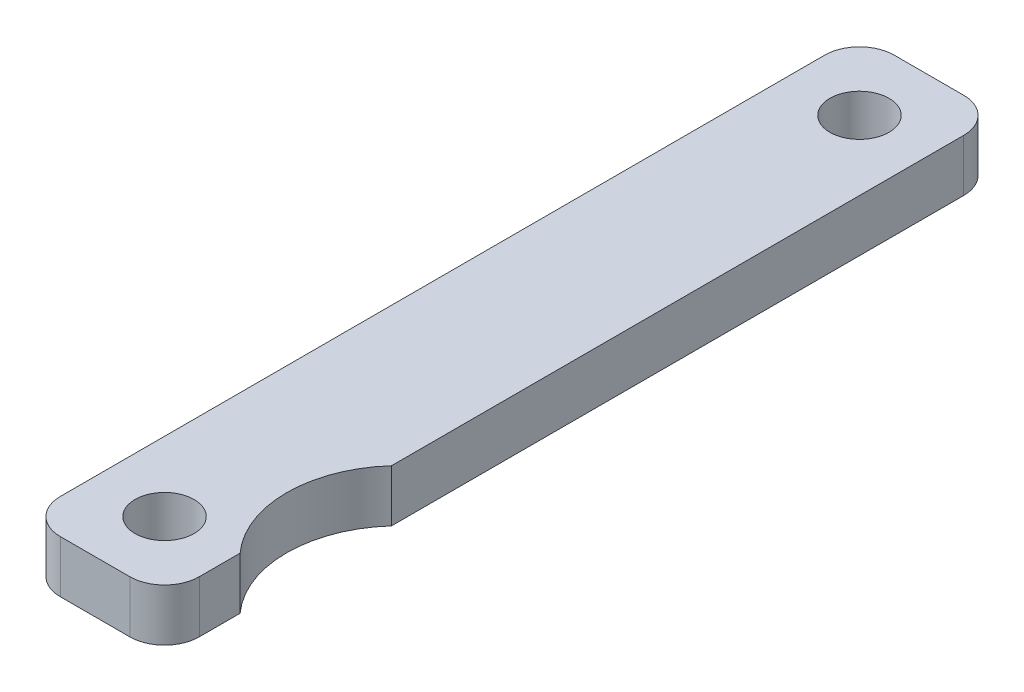
ISO-10303-21;
HEADER;
FILE_DESCRIPTION(('STEP AP214'),'2;1');
FILE_NAME('part.step','',(''),(''),'','','');
FILE_SCHEMA(('AUTOMOTIVE_DESIGN { 1 0 10303 214 1 1 1 1 }'));
ENDSEC;
DATA;
#1=APPLICATION_CONTEXT('core data for automotive mechanical design processes');
#2=APPLICATION_PROTOCOL_DEFINITION('international standard','automotive_design',2000,#1);
#3=PRODUCT_CONTEXT('',#1,'mechanical');
#4=PRODUCT('Part','Part','',(#3));
#5=PRODUCT_RELATED_PRODUCT_CATEGORY('part','',(#4));
#6=PRODUCT_DEFINITION_FORMATION('','',#4);
#7=PRODUCT_DEFINITION_CONTEXT('part definition',#1,'design');
#8=PRODUCT_DEFINITION('design','',#6,#7);
#9=PRODUCT_DEFINITION_SHAPE('','',#8);
#10=(LENGTH_UNIT() NAMED_UNIT(*) SI_UNIT(.MILLI.,.METRE.));
#11=(NAMED_UNIT(*) PLANE_ANGLE_UNIT() SI_UNIT($,.RADIAN.));
#12=(NAMED_UNIT(*) SI_UNIT($,.STERADIAN.) SOLID_ANGLE_UNIT());
#13=UNCERTAINTY_MEASURE_WITH_UNIT(LENGTH_MEASURE(1.E-05),#10,'distance_accuracy_value','');
#14=(GEOMETRIC_REPRESENTATION_CONTEXT(3) GLOBAL_UNCERTAINTY_ASSIGNED_CONTEXT((#13)) GLOBAL_UNIT_ASSIGNED_CONTEXT((#10,
#11,#12)) REPRESENTATION_CONTEXT('',''));
#15=CARTESIAN_POINT('',(0.,0.,0.));
#16=DIRECTION('',(0.,0.,1.));
#17=DIRECTION('',(1.,0.,0.));
#18=AXIS2_PLACEMENT_3D('',#15,#16,#17);
#19=CARTESIAN_POINT('',(4.00000000000001,3.,-22.));
#20=DIRECTION('',(-1.,0.,0.));
#21=DIRECTION('',(0.,0.,1.));
#22=AXIS2_PLACEMENT_3D('',#19,#20,#21);
#23=PLANE('',#22);
#24=DIRECTION('',(0.,0.,-1.));
#25=VECTOR('',#24,1.);
#26=CARTESIAN_POINT('',(4.00000000000001,0.,-22.));
#27=LINE('',#26,#25);
#28=CARTESIAN_POINT('',(4.00000000000001,0.,22.));
#29=VERTEX_POINT('',#28);
#30=CARTESIAN_POINT('',(4.00000000000001,0.,19.651084740786));
#31=VERTEX_POINT('',#30);
#32=EDGE_CURVE('E326',#29,#31,#27,.T.);
#33=ORIENTED_EDGE('',*,*,#32,.T.);
#34=DIRECTION('',(0.,1.,0.));
#35=VECTOR('',#34,1.);
#36=CARTESIAN_POINT('',(4.00000000000001,-12.5405838275533,19.651084740786));
#37=LINE('',#36,#35);
#38=CARTESIAN_POINT('',(4.00000000000001,3.,19.651084740786));
#39=VERTEX_POINT('',#38);
#40=EDGE_CURVE('E44',#31,#39,#37,.T.);
#41=ORIENTED_EDGE('',*,*,#40,.T.);
#42=DIRECTION('',(0.,0.,-1.));
#43=VECTOR('',#42,1.);
#44=CARTESIAN_POINT('',(4.00000000000001,3.,-22.));
#45=LINE('',#44,#43);
#46=CARTESIAN_POINT('',(4.00000000000001,3.,22.));
#47=VERTEX_POINT('',#46);
#48=EDGE_CURVE('E275',#47,#39,#45,.T.);
#49=ORIENTED_EDGE('',*,*,#48,.F.);
#50=DIRECTION('',(0.,-1.,0.));
#51=VECTOR('',#50,1.);
#52=CARTESIAN_POINT('',(4.00000000000001,3.,22.));
#53=LINE('',#52,#51);
#54=EDGE_CURVE('E218',#47,#29,#53,.T.);
#55=ORIENTED_EDGE('',*,*,#54,.T.);
#56=EDGE_LOOP('',(#33,#41,#49,#55));
#57=FACE_BOUND('',#56,.T.);
#58=ADVANCED_FACE('F210',(#57),#23,.F.);
#59=CARTESIAN_POINT('',(2.00000000000001,3.,22.));
#60=DIRECTION('',(0.,1.,0.));
#61=DIRECTION('',(0.,0.,1.));
#62=AXIS2_PLACEMENT_3D('',#59,#60,#61);
#63=PLANE('',#62);
#64=CARTESIAN_POINT('',(8.8234693724446,3.,15.2940050750569));
#65=DIRECTION('',(0.,1.,0.));
#66=DIRECTION('',(0.,0.,1.));
#67=AXIS2_PLACEMENT_3D('',#64,#65,#66);
#68=CIRCLE('',#67,6.50000000003239);
#69=CARTESIAN_POINT('',(4.00000000000001,3.,10.9369254093278));
#70=VERTEX_POINT('',#69);
#71=EDGE_CURVE('E368',#70,#39,#68,.T.);
#72=ORIENTED_EDGE('',*,*,#71,.F.);
#73=CARTESIAN_POINT('',(4.00000000000001,3.,-22.));
#74=VERTEX_POINT('',#73);
#75=EDGE_CURVE('E381',#70,#74,#45,.T.);
#76=ORIENTED_EDGE('',*,*,#75,.T.);
#77=CARTESIAN_POINT('',(2.00000000000001,3.,-22.));
#78=DIRECTION('',(0.,1.,0.));
#79=DIRECTION('',(0.,0.,-1.));
#80=AXIS2_PLACEMENT_3D('',#77,#78,#79);
#81=CIRCLE('',#80,2.);
#82=CARTESIAN_POINT('',(2.00000000000001,3.,-24.));
#83=VERTEX_POINT('',#82);
#84=EDGE_CURVE('E383',#74,#83,#81,.T.);
#85=ORIENTED_EDGE('',*,*,#84,.T.);
#86=DIRECTION('',(-1.,0.,0.));
#87=VECTOR('',#86,1.);
#88=CARTESIAN_POINT('',(-2.00000000000001,3.,-24.));
#89=LINE('',#88,#87);
#90=CARTESIAN_POINT('',(-2.00000000000001,3.,-24.));
#91=VERTEX_POINT('',#90);
#92=EDGE_CURVE('E385',#83,#91,#89,.T.);
#93=ORIENTED_EDGE('',*,*,#92,.T.);
#94=CARTESIAN_POINT('',(-2.00000000000001,3.,-22.));
#95=DIRECTION('',(0.,1.,0.));
#96=DIRECTION('',(0.,0.,1.));
#97=AXIS2_PLACEMENT_3D('',#94,#95,#96);
#98=CIRCLE('',#97,2.);
#99=CARTESIAN_POINT('',(-4.00000000000001,3.,-22.));
#100=VERTEX_POINT('',#99);
#101=EDGE_CURVE('E300',#91,#100,#98,.T.);
#102=ORIENTED_EDGE('',*,*,#101,.T.);
#103=DIRECTION('',(0.,0.,1.));
#104=VECTOR('',#103,1.);
#105=CARTESIAN_POINT('',(-4.00000000000001,3.,-22.));
#106=LINE('',#105,#104);
#107=CARTESIAN_POINT('',(-4.,3.,22.));
#108=VERTEX_POINT('',#107);
#109=EDGE_CURVE('E291',#100,#108,#106,.T.);
#110=ORIENTED_EDGE('',*,*,#109,.T.);
#111=CARTESIAN_POINT('',(-2.,3.,22.));
#112=DIRECTION('',(0.,1.,0.));
#113=DIRECTION('',(0.,0.,1.));
#114=AXIS2_PLACEMENT_3D('',#111,#112,#113);
#115=CIRCLE('',#114,2.);
#116=CARTESIAN_POINT('',(-2.00000000000001,3.,24.));
#117=VERTEX_POINT('',#116);
#118=EDGE_CURVE('E297',#108,#117,#115,.T.);
#119=ORIENTED_EDGE('',*,*,#118,.T.);
#120=DIRECTION('',(1.,0.,0.));
#121=VECTOR('',#120,1.);
#122=CARTESIAN_POINT('',(-2.00000000000001,3.,24.));
#123=LINE('',#122,#121);
#124=CARTESIAN_POINT('',(2.00000000000001,3.,24.));
#125=VERTEX_POINT('',#124);
#126=EDGE_CURVE('E234',#117,#125,#123,.T.);
#127=ORIENTED_EDGE('',*,*,#126,.T.);
#128=CARTESIAN_POINT('',(2.00000000000001,3.,22.));
#129=DIRECTION('',(0.,1.,0.));
#130=DIRECTION('',(0.,0.,1.));
#131=AXIS2_PLACEMENT_3D('',#128,#129,#130);
#132=CIRCLE('',#131,2.);
#133=EDGE_CURVE('E339',#125,#47,#132,.T.);
#134=ORIENTED_EDGE('',*,*,#133,.T.);
#135=ORIENTED_EDGE('',*,*,#48,.T.);
#136=EDGE_LOOP('',(#72,#76,#85,#93,#102,#110,#119,#127,#134,#135));
#137=FACE_BOUND('',#136,.T.);
#138=CARTESIAN_POINT('',(0.,3.,-20.));
#139=DIRECTION('',(0.,1.,0.));
#140=DIRECTION('',(0.,0.,1.));
#141=AXIS2_PLACEMENT_3D('',#138,#139,#140);
#142=CIRCLE('',#141,1.7);
#143=CARTESIAN_POINT('',(0.,3.,-18.3));
#144=VERTEX_POINT('',#143);
#145=EDGE_CURVE('E325',#144,#144,#142,.T.);
#146=ORIENTED_EDGE('',*,*,#145,.F.);
#147=EDGE_LOOP('',(#146));
#148=FACE_BOUND('',#147,.T.);
#149=CARTESIAN_POINT('',(0.,3.,20.));
#150=DIRECTION('',(0.,1.,0.));
#151=DIRECTION('',(0.,0.,-1.));
#152=AXIS2_PLACEMENT_3D('',#149,#150,#151);
#153=CIRCLE('',#152,1.7);
#154=CARTESIAN_POINT('',(0.,3.,18.3));
#155=VERTEX_POINT('',#154);
#156=EDGE_CURVE('E366',#155,#155,#153,.T.);
#157=ORIENTED_EDGE('',*,*,#156,.F.);
#158=EDGE_LOOP('',(#157));
#159=FACE_BOUND('',#158,.T.);
#160=ADVANCED_FACE('F294',(#137,#148,#159),#63,.T.);
#161=CARTESIAN_POINT('',(2.00000000000001,0.,22.));
#162=DIRECTION('',(0.,1.,0.));
#163=DIRECTION('',(0.,0.,1.));
#164=AXIS2_PLACEMENT_3D('',#161,#162,#163);
#165=PLANE('',#164);
#166=CARTESIAN_POINT('',(4.00000000000001,0.,10.9369254093278));
#167=VERTEX_POINT('',#166);
#168=CARTESIAN_POINT('',(4.00000000000001,0.,-22.));
#169=VERTEX_POINT('',#168);
#170=EDGE_CURVE('E324',#167,#169,#27,.T.);
#171=ORIENTED_EDGE('',*,*,#170,.F.);
#172=CARTESIAN_POINT('',(8.8234693724446,0.,15.2940050750569));
#173=DIRECTION('',(0.,1.,0.));
#174=DIRECTION('',(0.,0.,1.));
#175=AXIS2_PLACEMENT_3D('',#172,#173,#174);
#176=CIRCLE('',#175,6.50000000003239);
#177=EDGE_CURVE('E225',#31,#167,#176,.F.);
#178=ORIENTED_EDGE('',*,*,#177,.F.);
#179=ORIENTED_EDGE('',*,*,#32,.F.);
#180=CARTESIAN_POINT('',(2.00000000000001,0.,22.));
#181=DIRECTION('',(0.,1.,0.));
#182=DIRECTION('',(0.,0.,1.));
#183=AXIS2_PLACEMENT_3D('',#180,#181,#182);
#184=CIRCLE('',#183,2.);
#185=CARTESIAN_POINT('',(2.00000000000001,0.,24.));
#186=VERTEX_POINT('',#185);
#187=EDGE_CURVE('E321',#186,#29,#184,.T.);
#188=ORIENTED_EDGE('',*,*,#187,.F.);
#189=DIRECTION('',(1.,0.,0.));
#190=VECTOR('',#189,1.);
#191=CARTESIAN_POINT('',(-2.00000000000001,0.,24.));
#192=LINE('',#191,#190);
#193=CARTESIAN_POINT('',(-2.00000000000001,0.,24.));
#194=VERTEX_POINT('',#193);
#195=EDGE_CURVE('E267',#194,#186,#192,.T.);
#196=ORIENTED_EDGE('',*,*,#195,.F.);
#197=CARTESIAN_POINT('',(-2.,0.,22.));
#198=DIRECTION('',(0.,1.,0.));
#199=DIRECTION('',(0.,0.,1.));
#200=AXIS2_PLACEMENT_3D('',#197,#198,#199);
#201=CIRCLE('',#200,2.);
#202=CARTESIAN_POINT('',(-4.,0.,22.));
#203=VERTEX_POINT('',#202);
#204=EDGE_CURVE('E336',#203,#194,#201,.T.);
#205=ORIENTED_EDGE('',*,*,#204,.F.);
#206=DIRECTION('',(0.,0.,1.));
#207=VECTOR('',#206,1.);
#208=CARTESIAN_POINT('',(-4.00000000000001,0.,-22.));
#209=LINE('',#208,#207);
#210=CARTESIAN_POINT('',(-4.00000000000001,0.,-22.));
#211=VERTEX_POINT('',#210);
#212=EDGE_CURVE('E309',#211,#203,#209,.T.);
#213=ORIENTED_EDGE('',*,*,#212,.F.);
#214=CARTESIAN_POINT('',(-2.00000000000001,0.,-22.));
#215=DIRECTION('',(0.,1.,0.));
#216=DIRECTION('',(0.,0.,1.));
#217=AXIS2_PLACEMENT_3D('',#214,#215,#216);
#218=CIRCLE('',#217,2.);
#219=CARTESIAN_POINT('',(-2.00000000000001,0.,-24.));
#220=VERTEX_POINT('',#219);
#221=EDGE_CURVE('E333',#220,#211,#218,.T.);
#222=ORIENTED_EDGE('',*,*,#221,.F.);
#223=DIRECTION('',(-1.,0.,0.));
#224=VECTOR('',#223,1.);
#225=CARTESIAN_POINT('',(-2.00000000000001,0.,-24.));
#226=LINE('',#225,#224);
#227=CARTESIAN_POINT('',(2.00000000000001,0.,-24.));
#228=VERTEX_POINT('',#227);
#229=EDGE_CURVE('E331',#228,#220,#226,.T.);
#230=ORIENTED_EDGE('',*,*,#229,.F.);
#231=CARTESIAN_POINT('',(2.00000000000001,0.,-22.));
#232=DIRECTION('',(0.,1.,0.));
#233=DIRECTION('',(0.,0.,-1.));
#234=AXIS2_PLACEMENT_3D('',#231,#232,#233);
#235=CIRCLE('',#234,2.);
#236=EDGE_CURVE('E329',#169,#228,#235,.T.);
#237=ORIENTED_EDGE('',*,*,#236,.F.);
#238=EDGE_LOOP('',(#171,#178,#179,#188,#196,#205,#213,#222,#230,#237));
#239=FACE_BOUND('',#238,.T.);
#240=CARTESIAN_POINT('',(0.,0.,-20.));
#241=DIRECTION('',(0.,1.,0.));
#242=DIRECTION('',(0.,0.,1.));
#243=AXIS2_PLACEMENT_3D('',#240,#241,#242);
#244=CIRCLE('',#243,1.7);
#245=CARTESIAN_POINT('',(0.,0.,-18.3));
#246=VERTEX_POINT('',#245);
#247=EDGE_CURVE('E374',#246,#246,#244,.T.);
#248=ORIENTED_EDGE('',*,*,#247,.T.);
#249=EDGE_LOOP('',(#248));
#250=FACE_BOUND('',#249,.T.);
#251=CARTESIAN_POINT('',(0.,0.,20.));
#252=DIRECTION('',(0.,1.,0.));
#253=DIRECTION('',(0.,0.,-1.));
#254=AXIS2_PLACEMENT_3D('',#251,#252,#253);
#255=CIRCLE('',#254,1.7);
#256=CARTESIAN_POINT('',(0.,0.,18.3));
#257=VERTEX_POINT('',#256);
#258=EDGE_CURVE('E362',#257,#257,#255,.T.);
#259=ORIENTED_EDGE('',*,*,#258,.T.);
#260=EDGE_LOOP('',(#259));
#261=FACE_BOUND('',#260,.T.);
#262=ADVANCED_FACE('F358',(#239,#250,#261),#165,.F.);
#263=CARTESIAN_POINT('',(2.00000000000001,3.,22.));
#264=DIRECTION('',(0.,-1.,0.));
#265=DIRECTION('',(0.,0.,-1.));
#266=AXIS2_PLACEMENT_3D('',#263,#264,#265);
#267=CYLINDRICAL_SURFACE('',#266,2.);
#268=ORIENTED_EDGE('',*,*,#187,.T.);
#269=ORIENTED_EDGE('',*,*,#54,.F.);
#270=ORIENTED_EDGE('',*,*,#133,.F.);
#271=DIRECTION('',(0.,-1.,0.));
#272=VECTOR('',#271,1.);
#273=CARTESIAN_POINT('',(2.00000000000001,3.,24.));
#274=LINE('',#273,#272);
#275=EDGE_CURVE('E317',#125,#186,#274,.T.);
#276=ORIENTED_EDGE('',*,*,#275,.T.);
#277=EDGE_LOOP('',(#268,#269,#270,#276));
#278=FACE_BOUND('',#277,.T.);
#279=ADVANCED_FACE('F212',(#278),#267,.T.);
#280=ORIENTED_EDGE('',*,*,#75,.F.);
#281=DIRECTION('',(0.,1.,0.));
#282=VECTOR('',#281,1.);
#283=CARTESIAN_POINT('',(4.00000000000001,-12.5405838275533,10.9369254093278));
#284=LINE('',#283,#282);
#285=EDGE_CURVE('E363',#167,#70,#284,.T.);
#286=ORIENTED_EDGE('',*,*,#285,.F.);
#287=ORIENTED_EDGE('',*,*,#170,.T.);
#288=DIRECTION('',(0.,-1.,0.));
#289=VECTOR('',#288,1.);
#290=CARTESIAN_POINT('',(4.00000000000001,3.,-22.));
#291=LINE('',#290,#289);
#292=EDGE_CURVE('E349',#74,#169,#291,.T.);
#293=ORIENTED_EDGE('',*,*,#292,.F.);
#294=EDGE_LOOP('',(#280,#286,#287,#293));
#295=FACE_BOUND('',#294,.T.);
#296=ADVANCED_FACE('F401',(#295),#23,.F.);
#297=CARTESIAN_POINT('',(2.00000000000001,3.,-22.));
#298=DIRECTION('',(0.,-1.,0.));
#299=DIRECTION('',(0.,0.,-1.));
#300=AXIS2_PLACEMENT_3D('',#297,#298,#299);
#301=CYLINDRICAL_SURFACE('',#300,2.);
#302=ORIENTED_EDGE('',*,*,#236,.T.);
#303=DIRECTION('',(0.,-1.,0.));
#304=VECTOR('',#303,1.);
#305=CARTESIAN_POINT('',(2.00000000000001,3.,-24.));
#306=LINE('',#305,#304);
#307=EDGE_CURVE('E346',#83,#228,#306,.T.);
#308=ORIENTED_EDGE('',*,*,#307,.F.);
#309=ORIENTED_EDGE('',*,*,#84,.F.);
#310=ORIENTED_EDGE('',*,*,#292,.T.);
#311=EDGE_LOOP('',(#302,#308,#309,#310));
#312=FACE_BOUND('',#311,.T.);
#313=ADVANCED_FACE('F404',(#312),#301,.T.);
#314=CARTESIAN_POINT('',(-2.00000000000001,3.,-24.));
#315=DIRECTION('',(0.,0.,1.));
#316=DIRECTION('',(1.,0.,0.));
#317=AXIS2_PLACEMENT_3D('',#314,#315,#316);
#318=PLANE('',#317);
#319=ORIENTED_EDGE('',*,*,#229,.T.);
#320=DIRECTION('',(0.,-1.,0.));
#321=VECTOR('',#320,1.);
#322=CARTESIAN_POINT('',(-2.00000000000001,3.,-24.));
#323=LINE('',#322,#321);
#324=EDGE_CURVE('E343',#91,#220,#323,.T.);
#325=ORIENTED_EDGE('',*,*,#324,.F.);
#326=ORIENTED_EDGE('',*,*,#92,.F.);
#327=ORIENTED_EDGE('',*,*,#307,.T.);
#328=EDGE_LOOP('',(#319,#325,#326,#327));
#329=FACE_BOUND('',#328,.T.);
#330=ADVANCED_FACE('F391',(#329),#318,.F.);
#331=CARTESIAN_POINT('',(-2.00000000000001,3.,-22.));
#332=DIRECTION('',(0.,-1.,0.));
#333=DIRECTION('',(0.,0.,-1.));
#334=AXIS2_PLACEMENT_3D('',#331,#332,#333);
#335=CYLINDRICAL_SURFACE('',#334,2.);
#336=ORIENTED_EDGE('',*,*,#221,.T.);
#337=DIRECTION('',(0.,-1.,0.));
#338=VECTOR('',#337,1.);
#339=CARTESIAN_POINT('',(-4.00000000000001,3.,-22.));
#340=LINE('',#339,#338);
#341=EDGE_CURVE('E312',#100,#211,#340,.T.);
#342=ORIENTED_EDGE('',*,*,#341,.F.);
#343=ORIENTED_EDGE('',*,*,#101,.F.);
#344=ORIENTED_EDGE('',*,*,#324,.T.);
#345=EDGE_LOOP('',(#336,#342,#343,#344));
#346=FACE_BOUND('',#345,.T.);
#347=ADVANCED_FACE('F395',(#346),#335,.T.);
#348=CARTESIAN_POINT('',(-4.00000000000001,3.,-22.));
#349=DIRECTION('',(1.,0.,0.));
#350=DIRECTION('',(0.,0.,-1.));
#351=AXIS2_PLACEMENT_3D('',#348,#349,#350);
#352=PLANE('',#351);
#353=ORIENTED_EDGE('',*,*,#212,.T.);
#354=DIRECTION('',(0.,-1.,0.));
#355=VECTOR('',#354,1.);
#356=CARTESIAN_POINT('',(-4.,3.,22.));
#357=LINE('',#356,#355);
#358=EDGE_CURVE('E306',#108,#203,#357,.T.);
#359=ORIENTED_EDGE('',*,*,#358,.F.);
#360=ORIENTED_EDGE('',*,*,#109,.F.);
#361=ORIENTED_EDGE('',*,*,#341,.T.);
#362=EDGE_LOOP('',(#353,#359,#360,#361));
#363=FACE_BOUND('',#362,.T.);
#364=ADVANCED_FACE('F307',(#363),#352,.F.);
#365=CARTESIAN_POINT('',(-2.,3.,22.));
#366=DIRECTION('',(0.,-1.,0.));
#367=DIRECTION('',(0.,0.,-1.));
#368=AXIS2_PLACEMENT_3D('',#365,#366,#367);
#369=CYLINDRICAL_SURFACE('',#368,2.);
#370=ORIENTED_EDGE('',*,*,#204,.T.);
#371=DIRECTION('',(0.,-1.,0.));
#372=VECTOR('',#371,1.);
#373=CARTESIAN_POINT('',(-2.00000000000001,3.,24.));
#374=LINE('',#373,#372);
#375=EDGE_CURVE('E313',#117,#194,#374,.T.);
#376=ORIENTED_EDGE('',*,*,#375,.F.);
#377=ORIENTED_EDGE('',*,*,#118,.F.);
#378=ORIENTED_EDGE('',*,*,#358,.T.);
#379=EDGE_LOOP('',(#370,#376,#377,#378));
#380=FACE_BOUND('',#379,.T.);
#381=ADVANCED_FACE('F315',(#380),#369,.T.);
#382=CARTESIAN_POINT('',(-2.00000000000001,3.,24.));
#383=DIRECTION('',(0.,0.,-1.));
#384=DIRECTION('',(-1.,0.,0.));
#385=AXIS2_PLACEMENT_3D('',#382,#383,#384);
#386=PLANE('',#385);
#387=ORIENTED_EDGE('',*,*,#195,.T.);
#388=ORIENTED_EDGE('',*,*,#275,.F.);
#389=ORIENTED_EDGE('',*,*,#126,.F.);
#390=ORIENTED_EDGE('',*,*,#375,.T.);
#391=EDGE_LOOP('',(#387,#388,#389,#390));
#392=FACE_BOUND('',#391,.T.);
#393=ADVANCED_FACE('F396',(#392),#386,.F.);
#394=CARTESIAN_POINT('',(0.,3.,-20.));
#395=DIRECTION('',(0.,-1.,0.));
#396=DIRECTION('',(0.,0.,-1.));
#397=AXIS2_PLACEMENT_3D('',#394,#395,#396);
#398=CYLINDRICAL_SURFACE('',#397,1.7);
#399=ORIENTED_EDGE('',*,*,#145,.T.);
#400=EDGE_LOOP('',(#399));
#401=FACE_BOUND('',#400,.T.);
#402=ORIENTED_EDGE('',*,*,#247,.F.);
#403=EDGE_LOOP('',(#402));
#404=FACE_BOUND('',#403,.T.);
#405=ADVANCED_FACE('F422',(#401,#404),#398,.F.);
#406=CARTESIAN_POINT('',(0.,3.,20.));
#407=DIRECTION('',(0.,-1.,0.));
#408=DIRECTION('',(0.,0.,-1.));
#409=AXIS2_PLACEMENT_3D('',#406,#407,#408);
#410=CYLINDRICAL_SURFACE('',#409,1.7);
#411=ORIENTED_EDGE('',*,*,#156,.T.);
#412=EDGE_LOOP('',(#411));
#413=FACE_BOUND('',#412,.T.);
#414=ORIENTED_EDGE('',*,*,#258,.F.);
#415=EDGE_LOOP('',(#414));
#416=FACE_BOUND('',#415,.T.);
#417=ADVANCED_FACE('F454',(#413,#416),#410,.F.);
#418=CARTESIAN_POINT('',(8.8234693724446,-12.5405838275533,15.2940050750569));
#419=DIRECTION('',(0.,1.,0.));
#420=DIRECTION('',(0.,0.,1.));
#421=AXIS2_PLACEMENT_3D('',#418,#419,#420);
#422=CYLINDRICAL_SURFACE('',#421,6.50000000003239);
#423=ORIENTED_EDGE('',*,*,#177,.T.);
#424=ORIENTED_EDGE('',*,*,#285,.T.);
#425=ORIENTED_EDGE('',*,*,#71,.T.);
#426=ORIENTED_EDGE('',*,*,#40,.F.);
#427=EDGE_LOOP('',(#423,#424,#425,#426));
#428=FACE_BOUND('',#427,.T.);
#429=ADVANCED_FACE('F398',(#428),#422,.F.);
#430=CLOSED_SHELL('',(#58,#160,#262,#279,#296,#313,#330,#347,#364,#381,#393,#405,#417,#429));
#431=MANIFOLD_SOLID_BREP('B6',#430);
#432=ADVANCED_BREP_SHAPE_REPRESENTATION('',(#18,#431),#14);
#433=SHAPE_DEFINITION_REPRESENTATION(#9,#432);
ENDSEC;
END-ISO-10303-21;
